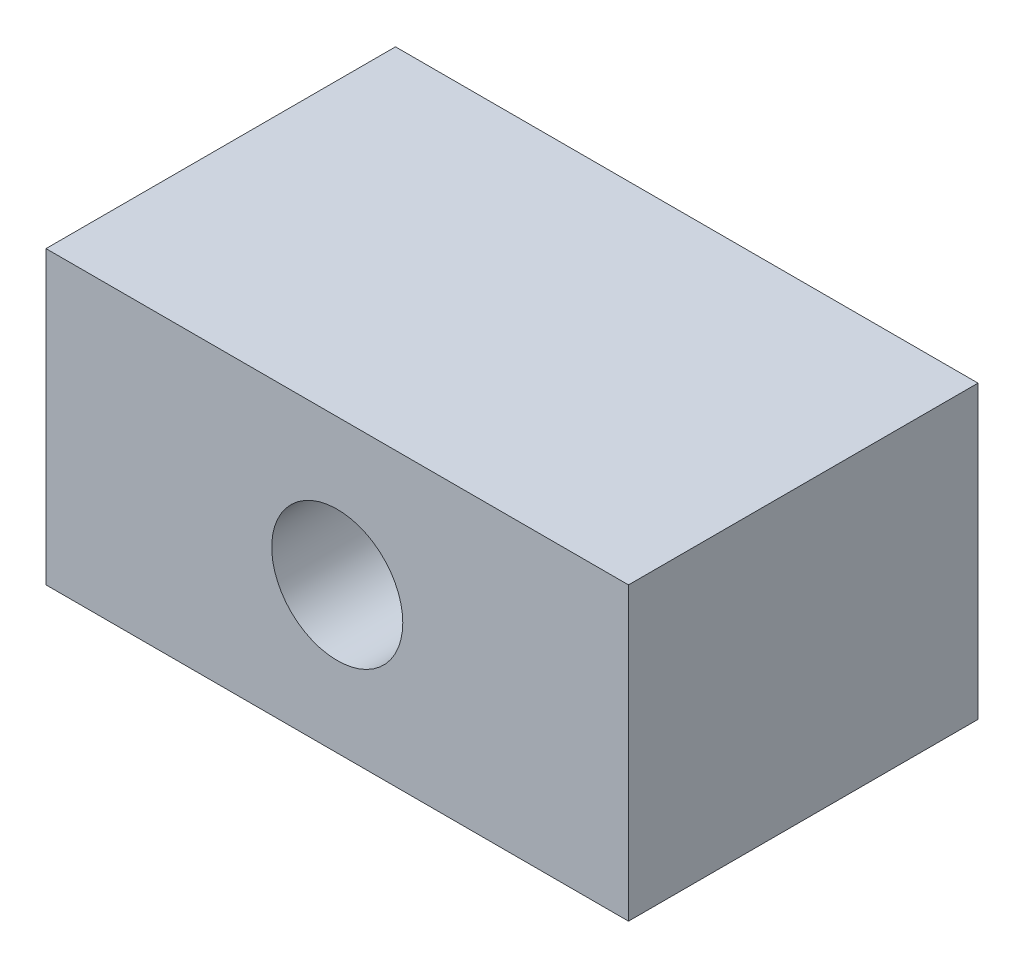
ISO-10303-21;
HEADER;
FILE_DESCRIPTION(('STEP AP214'),'2;1');
FILE_NAME('part.step','',(''),(''),'','','');
FILE_SCHEMA(('AUTOMOTIVE_DESIGN { 1 0 10303 214 1 1 1 1 }'));
ENDSEC;
DATA;
#1=APPLICATION_CONTEXT('core data for automotive mechanical design processes');
#2=APPLICATION_PROTOCOL_DEFINITION('international standard','automotive_design',2000,#1);
#3=PRODUCT_CONTEXT('',#1,'mechanical');
#4=PRODUCT('Part','Part','',(#3));
#5=PRODUCT_RELATED_PRODUCT_CATEGORY('part','',(#4));
#6=PRODUCT_DEFINITION_FORMATION('','',#4);
#7=PRODUCT_DEFINITION_CONTEXT('part definition',#1,'design');
#8=PRODUCT_DEFINITION('design','',#6,#7);
#9=PRODUCT_DEFINITION_SHAPE('','',#8);
#10=(LENGTH_UNIT() NAMED_UNIT(*) SI_UNIT(.MILLI.,.METRE.));
#11=(NAMED_UNIT(*) PLANE_ANGLE_UNIT() SI_UNIT($,.RADIAN.));
#12=(NAMED_UNIT(*) SI_UNIT($,.STERADIAN.) SOLID_ANGLE_UNIT());
#13=UNCERTAINTY_MEASURE_WITH_UNIT(LENGTH_MEASURE(1.E-05),#10,'distance_accuracy_value','');
#14=(GEOMETRIC_REPRESENTATION_CONTEXT(3) GLOBAL_UNCERTAINTY_ASSIGNED_CONTEXT((#13)) GLOBAL_UNIT_ASSIGNED_CONTEXT((#10,
#11,#12)) REPRESENTATION_CONTEXT('',''));
#15=CARTESIAN_POINT('',(0.,0.,0.));
#16=DIRECTION('',(0.,0.,1.));
#17=DIRECTION('',(1.,0.,0.));
#18=AXIS2_PLACEMENT_3D('',#15,#16,#17);
#19=CARTESIAN_POINT('',(-100.,100.,60.));
#20=DIRECTION('',(1.,0.,0.));
#21=DIRECTION('',(0.,0.,-1.));
#22=AXIS2_PLACEMENT_3D('',#19,#20,#21);
#23=PLANE('',#22);
#24=DIRECTION('',(0.,0.,1.));
#25=VECTOR('',#24,1.);
#26=CARTESIAN_POINT('',(-100.,0.,60.));
#27=LINE('',#26,#25);
#28=CARTESIAN_POINT('',(-100.,0.,-60.));
#29=VERTEX_POINT('',#28);
#30=CARTESIAN_POINT('',(-100.,0.,60.));
#31=VERTEX_POINT('',#30);
#32=EDGE_CURVE('E96',#29,#31,#27,.T.);
#33=ORIENTED_EDGE('',*,*,#32,.T.);
#34=DIRECTION('',(0.,-1.,0.));
#35=VECTOR('',#34,1.);
#36=CARTESIAN_POINT('',(-100.,100.,60.));
#37=LINE('',#36,#35);
#38=CARTESIAN_POINT('',(-100.,100.,60.));
#39=VERTEX_POINT('',#38);
#40=EDGE_CURVE('E11',#39,#31,#37,.T.);
#41=ORIENTED_EDGE('',*,*,#40,.F.);
#42=DIRECTION('',(0.,0.,1.));
#43=VECTOR('',#42,1.);
#44=CARTESIAN_POINT('',(-100.,100.,60.));
#45=LINE('',#44,#43);
#46=CARTESIAN_POINT('',(-100.,100.,-60.));
#47=VERTEX_POINT('',#46);
#48=EDGE_CURVE('E84',#47,#39,#45,.T.);
#49=ORIENTED_EDGE('',*,*,#48,.F.);
#50=DIRECTION('',(0.,-1.,0.));
#51=VECTOR('',#50,1.);
#52=CARTESIAN_POINT('',(-100.,100.,-60.));
#53=LINE('',#52,#51);
#54=EDGE_CURVE('E92',#47,#29,#53,.T.);
#55=ORIENTED_EDGE('',*,*,#54,.T.);
#56=EDGE_LOOP('',(#33,#41,#49,#55));
#57=FACE_BOUND('',#56,.T.);
#58=ADVANCED_FACE('F33',(#57),#23,.F.);
#59=CARTESIAN_POINT('',(100.,100.,60.));
#60=DIRECTION('',(0.,0.,-1.));
#61=DIRECTION('',(-1.,0.,0.));
#62=AXIS2_PLACEMENT_3D('',#59,#60,#61);
#63=PLANE('',#62);
#64=CARTESIAN_POINT('',(0.,50.,60.));
#65=DIRECTION('',(0.,0.,1.));
#66=DIRECTION('',(1.,0.,0.));
#67=AXIS2_PLACEMENT_3D('',#64,#65,#66);
#68=CIRCLE('',#67,22.5);
#69=CARTESIAN_POINT('',(22.5,50.,60.));
#70=VERTEX_POINT('',#69);
#71=EDGE_CURVE('E110',#70,#70,#68,.T.);
#72=ORIENTED_EDGE('',*,*,#71,.F.);
#73=EDGE_LOOP('',(#72));
#74=FACE_BOUND('',#73,.T.);
#75=DIRECTION('',(1.,0.,0.));
#76=VECTOR('',#75,1.);
#77=CARTESIAN_POINT('',(100.,0.,60.));
#78=LINE('',#77,#76);
#79=CARTESIAN_POINT('',(100.,0.,60.));
#80=VERTEX_POINT('',#79);
#81=EDGE_CURVE('E88',#31,#80,#78,.T.);
#82=ORIENTED_EDGE('',*,*,#81,.T.);
#83=DIRECTION('',(0.,-1.,0.));
#84=VECTOR('',#83,1.);
#85=CARTESIAN_POINT('',(100.,100.,60.));
#86=LINE('',#85,#84);
#87=CARTESIAN_POINT('',(100.,100.,60.));
#88=VERTEX_POINT('',#87);
#89=EDGE_CURVE('E41',#88,#80,#86,.T.);
#90=ORIENTED_EDGE('',*,*,#89,.F.);
#91=DIRECTION('',(1.,0.,0.));
#92=VECTOR('',#91,1.);
#93=CARTESIAN_POINT('',(100.,100.,60.));
#94=LINE('',#93,#92);
#95=EDGE_CURVE('E79',#39,#88,#94,.T.);
#96=ORIENTED_EDGE('',*,*,#95,.F.);
#97=ORIENTED_EDGE('',*,*,#40,.T.);
#98=EDGE_LOOP('',(#82,#90,#96,#97));
#99=FACE_BOUND('',#98,.T.);
#100=ADVANCED_FACE('F87',(#74,#99),#63,.F.);
#101=CARTESIAN_POINT('',(100.,100.,60.));
#102=DIRECTION('',(-1.,0.,0.));
#103=DIRECTION('',(0.,0.,1.));
#104=AXIS2_PLACEMENT_3D('',#101,#102,#103);
#105=PLANE('',#104);
#106=DIRECTION('',(0.,0.,-1.));
#107=VECTOR('',#106,1.);
#108=CARTESIAN_POINT('',(100.,0.,60.));
#109=LINE('',#108,#107);
#110=CARTESIAN_POINT('',(100.,0.,-60.));
#111=VERTEX_POINT('',#110);
#112=EDGE_CURVE('E66',#80,#111,#109,.T.);
#113=ORIENTED_EDGE('',*,*,#112,.T.);
#114=DIRECTION('',(0.,-1.,0.));
#115=VECTOR('',#114,1.);
#116=CARTESIAN_POINT('',(100.,100.,-60.));
#117=LINE('',#116,#115);
#118=CARTESIAN_POINT('',(100.,100.,-60.));
#119=VERTEX_POINT('',#118);
#120=EDGE_CURVE('E89',#119,#111,#117,.T.);
#121=ORIENTED_EDGE('',*,*,#120,.F.);
#122=DIRECTION('',(0.,0.,-1.));
#123=VECTOR('',#122,1.);
#124=CARTESIAN_POINT('',(100.,100.,60.));
#125=LINE('',#124,#123);
#126=EDGE_CURVE('E82',#88,#119,#125,.T.);
#127=ORIENTED_EDGE('',*,*,#126,.F.);
#128=ORIENTED_EDGE('',*,*,#89,.T.);
#129=EDGE_LOOP('',(#113,#121,#127,#128));
#130=FACE_BOUND('',#129,.T.);
#131=ADVANCED_FACE('F90',(#130),#105,.F.);
#132=CARTESIAN_POINT('',(100.,100.,-60.));
#133=DIRECTION('',(0.,0.,1.));
#134=DIRECTION('',(1.,0.,0.));
#135=AXIS2_PLACEMENT_3D('',#132,#133,#134);
#136=PLANE('',#135);
#137=CARTESIAN_POINT('',(0.,50.,-60.));
#138=DIRECTION('',(0.,0.,1.));
#139=DIRECTION('',(1.,0.,0.));
#140=AXIS2_PLACEMENT_3D('',#137,#138,#139);
#141=CIRCLE('',#140,22.5);
#142=CARTESIAN_POINT('',(22.5,50.,-60.));
#143=VERTEX_POINT('',#142);
#144=EDGE_CURVE('E99',#143,#143,#141,.T.);
#145=ORIENTED_EDGE('',*,*,#144,.T.);
#146=EDGE_LOOP('',(#145));
#147=FACE_BOUND('',#146,.T.);
#148=DIRECTION('',(-1.,0.,0.));
#149=VECTOR('',#148,1.);
#150=CARTESIAN_POINT('',(100.,0.,-60.));
#151=LINE('',#150,#149);
#152=EDGE_CURVE('E72',#111,#29,#151,.T.);
#153=ORIENTED_EDGE('',*,*,#152,.T.);
#154=ORIENTED_EDGE('',*,*,#54,.F.);
#155=DIRECTION('',(-1.,0.,0.));
#156=VECTOR('',#155,1.);
#157=CARTESIAN_POINT('',(100.,100.,-60.));
#158=LINE('',#157,#156);
#159=EDGE_CURVE('E49',#119,#47,#158,.T.);
#160=ORIENTED_EDGE('',*,*,#159,.F.);
#161=ORIENTED_EDGE('',*,*,#120,.T.);
#162=EDGE_LOOP('',(#153,#154,#160,#161));
#163=FACE_BOUND('',#162,.T.);
#164=ADVANCED_FACE('F104',(#147,#163),#136,.F.);
#165=CARTESIAN_POINT('',(0.,100.,0.));
#166=DIRECTION('',(0.,1.,0.));
#167=DIRECTION('',(0.,0.,1.));
#168=AXIS2_PLACEMENT_3D('',#165,#166,#167);
#169=PLANE('',#168);
#170=ORIENTED_EDGE('',*,*,#48,.T.);
#171=ORIENTED_EDGE('',*,*,#95,.T.);
#172=ORIENTED_EDGE('',*,*,#126,.T.);
#173=ORIENTED_EDGE('',*,*,#159,.T.);
#174=EDGE_LOOP('',(#170,#171,#172,#173));
#175=FACE_BOUND('',#174,.T.);
#176=ADVANCED_FACE('F80',(#175),#169,.T.);
#177=CARTESIAN_POINT('',(0.,0.,0.));
#178=DIRECTION('',(0.,1.,0.));
#179=DIRECTION('',(0.,0.,1.));
#180=AXIS2_PLACEMENT_3D('',#177,#178,#179);
#181=PLANE('',#180);
#182=ORIENTED_EDGE('',*,*,#32,.F.);
#183=ORIENTED_EDGE('',*,*,#152,.F.);
#184=ORIENTED_EDGE('',*,*,#112,.F.);
#185=ORIENTED_EDGE('',*,*,#81,.F.);
#186=EDGE_LOOP('',(#182,#183,#184,#185));
#187=FACE_BOUND('',#186,.T.);
#188=ADVANCED_FACE('F107',(#187),#181,.F.);
#189=CARTESIAN_POINT('',(0.,50.,-60.));
#190=DIRECTION('',(0.,0.,1.));
#191=DIRECTION('',(1.,0.,0.));
#192=AXIS2_PLACEMENT_3D('',#189,#190,#191);
#193=CYLINDRICAL_SURFACE('',#192,22.5);
#194=CARTESIAN_POINT('',(22.5,50.,-60.));
#195=CARTESIAN_POINT('',(22.5,50.,-58.75));
#196=CARTESIAN_POINT('',(22.5,50.,-57.5));
#197=CARTESIAN_POINT('',(22.5,50.,-55.));
#198=CARTESIAN_POINT('',(22.5,50.,-53.75));
#199=CARTESIAN_POINT('',(22.5,50.,-51.25));
#200=CARTESIAN_POINT('',(22.5,50.,-50.));
#201=CARTESIAN_POINT('',(22.5,50.,-47.5));
#202=CARTESIAN_POINT('',(22.5,50.,-46.25));
#203=CARTESIAN_POINT('',(22.5,50.,-43.75));
#204=CARTESIAN_POINT('',(22.5,50.,-42.5));
#205=CARTESIAN_POINT('',(22.5,50.,-40.));
#206=CARTESIAN_POINT('',(22.5,50.,-38.75));
#207=CARTESIAN_POINT('',(22.5,50.,-36.25));
#208=CARTESIAN_POINT('',(22.5,50.,-35.));
#209=CARTESIAN_POINT('',(22.5,50.,-32.5));
#210=CARTESIAN_POINT('',(22.5,50.,-31.25));
#211=CARTESIAN_POINT('',(22.5,50.,-28.75));
#212=CARTESIAN_POINT('',(22.5,50.,-27.5));
#213=CARTESIAN_POINT('',(22.5,50.,-25.));
#214=CARTESIAN_POINT('',(22.5,50.,-23.75));
#215=CARTESIAN_POINT('',(22.5,50.,-21.25));
#216=CARTESIAN_POINT('',(22.5,50.,-20.));
#217=CARTESIAN_POINT('',(22.5,50.,-17.5));
#218=CARTESIAN_POINT('',(22.5,50.,-16.25));
#219=CARTESIAN_POINT('',(22.5,50.,-13.75));
#220=CARTESIAN_POINT('',(22.5,50.,-12.5));
#221=CARTESIAN_POINT('',(22.5,50.,-10.));
#222=CARTESIAN_POINT('',(22.5,50.,-8.75000000000003));
#223=CARTESIAN_POINT('',(22.5,50.,-6.25000000000003));
#224=CARTESIAN_POINT('',(22.5,50.,-5.00000000000003));
#225=CARTESIAN_POINT('',(22.5,50.,-2.50000000000003));
#226=CARTESIAN_POINT('',(22.5,50.,-1.25000000000003));
#227=CARTESIAN_POINT('',(22.5,50.,1.24999999999997));
#228=CARTESIAN_POINT('',(22.5,50.,2.49999999999997));
#229=CARTESIAN_POINT('',(22.5,50.,4.99999999999997));
#230=CARTESIAN_POINT('',(22.5,50.,6.24999999999997));
#231=CARTESIAN_POINT('',(22.5,50.,8.74999999999997));
#232=CARTESIAN_POINT('',(22.5,50.,9.99999999999997));
#233=CARTESIAN_POINT('',(22.5,50.,12.5));
#234=CARTESIAN_POINT('',(22.5,50.,13.75));
#235=CARTESIAN_POINT('',(22.5,50.,16.25));
#236=CARTESIAN_POINT('',(22.5,50.,17.5));
#237=CARTESIAN_POINT('',(22.5,50.,20.));
#238=CARTESIAN_POINT('',(22.5,50.,21.25));
#239=CARTESIAN_POINT('',(22.5,50.,23.75));
#240=CARTESIAN_POINT('',(22.5,50.,25.));
#241=CARTESIAN_POINT('',(22.5,50.,27.5));
#242=CARTESIAN_POINT('',(22.5,50.,28.75));
#243=CARTESIAN_POINT('',(22.5,50.,31.25));
#244=CARTESIAN_POINT('',(22.5,50.,32.5));
#245=CARTESIAN_POINT('',(22.5,50.,35.));
#246=CARTESIAN_POINT('',(22.5,50.,36.25));
#247=CARTESIAN_POINT('',(22.5,50.,38.75));
#248=CARTESIAN_POINT('',(22.5,50.,40.));
#249=CARTESIAN_POINT('',(22.5,50.,42.5));
#250=CARTESIAN_POINT('',(22.5,50.,43.75));
#251=CARTESIAN_POINT('',(22.5,50.,46.25));
#252=CARTESIAN_POINT('',(22.5,50.,47.5));
#253=CARTESIAN_POINT('',(22.5,50.,50.));
#254=CARTESIAN_POINT('',(22.5,50.,51.25));
#255=CARTESIAN_POINT('',(22.5,50.,53.75));
#256=CARTESIAN_POINT('',(22.5,50.,55.));
#257=CARTESIAN_POINT('',(22.5,50.,57.5));
#258=CARTESIAN_POINT('',(22.5,50.,58.75));
#259=CARTESIAN_POINT('',(22.5,50.,60.));
#260=B_SPLINE_CURVE_WITH_KNOTS('',3,(#194,#195,#196,#197,#198,#199,#200,#201,#202,#203,#204,
#205,#206,#207,#208,#209,#210,#211,#212,#213,#214,#215,#216,#217,#218,#219,#220,#221,#222,#223,
#224,#225,#226,#227,#228,#229,#230,#231,#232,#233,#234,#235,#236,#237,#238,#239,#240,#241,#242,
#243,#244,#245,#246,#247,#248,#249,#250,#251,#252,#253,#254,#255,#256,#257,#258,#259),
.UNSPECIFIED.,.F.,.F.,(4,2,2,2,2,2,2,2,2,2,2,2,2,2,2,2,2,2,2,2,2,2,2,2,2,2,2,2,2,2,2,2,4),(0.,
3.75,7.5,11.25,15.,18.75,22.5,26.25,30.,33.75,37.5,41.25,45.,48.75,52.5,56.25,60.,63.75,67.5,
71.25,75.,78.75,82.5,86.25,90.,93.75,97.5,101.25,105.,108.75,112.5,116.25,120.),.UNSPECIFIED.);
#261=EDGE_CURVE('BSEAM117',#143,#70,#260,.T.);
#262=ORIENTED_EDGE('',*,*,#144,.F.);
#263=ORIENTED_EDGE('',*,*,#71,.T.);
#264=ORIENTED_EDGE('',*,*,#261,.T.);
#265=ORIENTED_EDGE('',*,*,#261,.F.);
#266=EDGE_LOOP('',(#262,#264,#263,#265));
#267=FACE_BOUND('',#266,.T.);
#268=ADVANCED_FACE('F117',(#267),#193,.F.);
#269=CLOSED_SHELL('',(#58,#100,#131,#164,#176,#188,#268));
#270=MANIFOLD_SOLID_BREP('B2',#269);
#271=ADVANCED_BREP_SHAPE_REPRESENTATION('',(#18,#270),#14);
#272=SHAPE_DEFINITION_REPRESENTATION(#9,#271);
ENDSEC;
END-ISO-10303-21;
